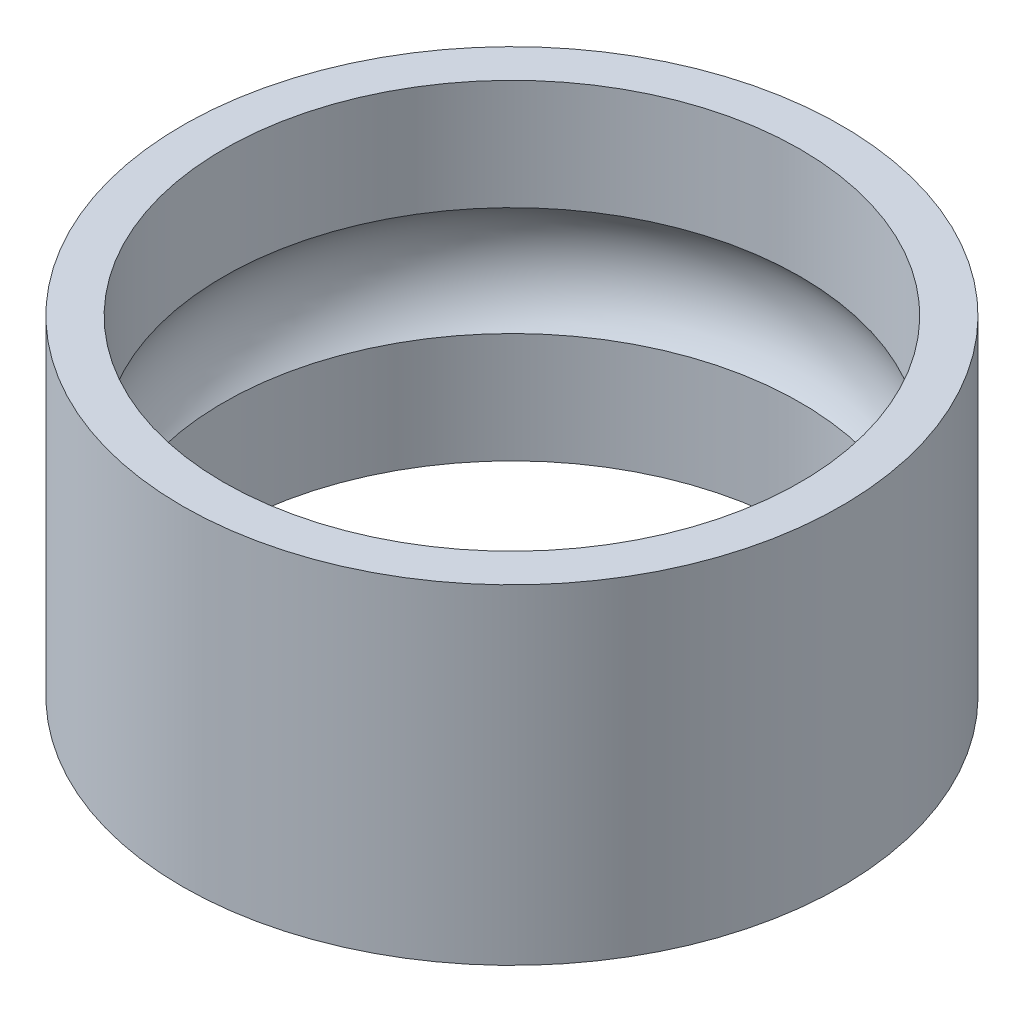
ISO-10303-21;
HEADER;
FILE_DESCRIPTION(('STEP AP214'),'2;1');
FILE_NAME('part.step','',(''),(''),'','','');
FILE_SCHEMA(('AUTOMOTIVE_DESIGN { 1 0 10303 214 1 1 1 1 }'));
ENDSEC;
DATA;
#1=APPLICATION_CONTEXT('core data for automotive mechanical design processes');
#2=APPLICATION_PROTOCOL_DEFINITION('international standard','automotive_design',2000,#1);
#3=PRODUCT_CONTEXT('',#1,'mechanical');
#4=PRODUCT('Part','Part','',(#3));
#5=PRODUCT_RELATED_PRODUCT_CATEGORY('part','',(#4));
#6=PRODUCT_DEFINITION_FORMATION('','',#4);
#7=PRODUCT_DEFINITION_CONTEXT('part definition',#1,'design');
#8=PRODUCT_DEFINITION('design','',#6,#7);
#9=PRODUCT_DEFINITION_SHAPE('','',#8);
#10=(LENGTH_UNIT() NAMED_UNIT(*) SI_UNIT(.MILLI.,.METRE.));
#11=(NAMED_UNIT(*) PLANE_ANGLE_UNIT() SI_UNIT($,.RADIAN.));
#12=(NAMED_UNIT(*) SI_UNIT($,.STERADIAN.) SOLID_ANGLE_UNIT());
#13=UNCERTAINTY_MEASURE_WITH_UNIT(LENGTH_MEASURE(1.E-05),#10,'distance_accuracy_value','');
#14=(GEOMETRIC_REPRESENTATION_CONTEXT(3) GLOBAL_UNCERTAINTY_ASSIGNED_CONTEXT((#13)) GLOBAL_UNIT_ASSIGNED_CONTEXT((#10,
#11,#12)) REPRESENTATION_CONTEXT('',''));
#15=CARTESIAN_POINT('',(0.,0.,0.));
#16=DIRECTION('',(0.,0.,1.));
#17=DIRECTION('',(1.,0.,0.));
#18=AXIS2_PLACEMENT_3D('',#15,#16,#17);
#19=CARTESIAN_POINT('',(0.,2.,0.));
#20=DIRECTION('',(0.,-1.,0.));
#21=DIRECTION('',(0.,0.,-1.));
#22=AXIS2_PLACEMENT_3D('',#19,#20,#21);
#23=CYLINDRICAL_SURFACE('',#22,3.5);
#24=CARTESIAN_POINT('',(0.,2.,0.));
#25=DIRECTION('',(0.,1.,0.));
#26=DIRECTION('',(0.,0.,1.));
#27=AXIS2_PLACEMENT_3D('',#24,#25,#26);
#28=CIRCLE('',#27,3.5);
#29=CARTESIAN_POINT('',(0.,2.,3.5));
#30=VERTEX_POINT('',#29);
#31=EDGE_CURVE('E51',#30,#30,#28,.T.);
#32=ORIENTED_EDGE('',*,*,#31,.T.);
#33=EDGE_LOOP('',(#32));
#34=FACE_BOUND('',#33,.T.);
#35=CARTESIAN_POINT('',(0.,0.661437827766148,0.));
#36=DIRECTION('',(0.,-1.,0.));
#37=DIRECTION('',(0.,0.,-1.));
#38=AXIS2_PLACEMENT_3D('',#35,#36,#37);
#39=CIRCLE('',#38,3.5);
#40=CARTESIAN_POINT('',(0.,0.661437827766148,-3.5));
#41=VERTEX_POINT('',#40);
#42=EDGE_CURVE('E39',#41,#41,#39,.T.);
#43=ORIENTED_EDGE('',*,*,#42,.T.);
#44=EDGE_LOOP('',(#43));
#45=FACE_BOUND('',#44,.T.);
#46=ADVANCED_FACE('F35',(#34,#45),#23,.F.);
#47=CARTESIAN_POINT('',(0.,-2.,0.));
#48=DIRECTION('',(0.,1.,0.));
#49=DIRECTION('',(0.,0.,1.));
#50=AXIS2_PLACEMENT_3D('',#47,#48,#49);
#51=CIRCLE('',#50,3.5);
#52=CARTESIAN_POINT('',(0.,-2.,3.5));
#53=VERTEX_POINT('',#52);
#54=EDGE_CURVE('E54',#53,#53,#51,.T.);
#55=ORIENTED_EDGE('',*,*,#54,.F.);
#56=EDGE_LOOP('',(#55));
#57=FACE_BOUND('',#56,.T.);
#58=CARTESIAN_POINT('',(0.,-0.661437827766148,0.));
#59=DIRECTION('',(0.,1.,0.));
#60=DIRECTION('',(0.,0.,1.));
#61=AXIS2_PLACEMENT_3D('',#58,#59,#60);
#62=CIRCLE('',#61,3.5);
#63=CARTESIAN_POINT('',(0.,-0.661437827766148,3.5));
#64=VERTEX_POINT('',#63);
#65=EDGE_CURVE('E56',#64,#64,#62,.T.);
#66=ORIENTED_EDGE('',*,*,#65,.T.);
#67=EDGE_LOOP('',(#66));
#68=FACE_BOUND('',#67,.T.);
#69=ADVANCED_FACE('F76',(#57,#68),#23,.F.);
#70=CARTESIAN_POINT('',(0.,2.,0.));
#71=DIRECTION('',(0.,1.,0.));
#72=DIRECTION('',(0.,0.,1.));
#73=AXIS2_PLACEMENT_3D('',#70,#71,#72);
#74=PLANE('',#73);
#75=CARTESIAN_POINT('',(0.,2.,0.));
#76=DIRECTION('',(0.,1.,0.));
#77=DIRECTION('',(0.,0.,1.));
#78=AXIS2_PLACEMENT_3D('',#75,#76,#77);
#79=CIRCLE('',#78,4.);
#80=CARTESIAN_POINT('',(0.,2.,4.));
#81=VERTEX_POINT('',#80);
#82=EDGE_CURVE('E10',#81,#81,#79,.T.);
#83=ORIENTED_EDGE('',*,*,#82,.T.);
#84=EDGE_LOOP('',(#83));
#85=FACE_BOUND('',#84,.T.);
#86=ORIENTED_EDGE('',*,*,#31,.F.);
#87=EDGE_LOOP('',(#86));
#88=FACE_BOUND('',#87,.T.);
#89=ADVANCED_FACE('F73',(#85,#88),#74,.T.);
#90=CARTESIAN_POINT('',(0.,-2.,0.));
#91=DIRECTION('',(0.,1.,0.));
#92=DIRECTION('',(0.,0.,1.));
#93=AXIS2_PLACEMENT_3D('',#90,#91,#92);
#94=PLANE('',#93);
#95=CARTESIAN_POINT('',(0.,-2.,0.));
#96=DIRECTION('',(0.,1.,0.));
#97=DIRECTION('',(0.,0.,1.));
#98=AXIS2_PLACEMENT_3D('',#95,#96,#97);
#99=CIRCLE('',#98,4.);
#100=CARTESIAN_POINT('',(0.,-2.,4.));
#101=VERTEX_POINT('',#100);
#102=EDGE_CURVE('E44',#101,#101,#99,.T.);
#103=ORIENTED_EDGE('',*,*,#102,.F.);
#104=EDGE_LOOP('',(#103));
#105=FACE_BOUND('',#104,.T.);
#106=ORIENTED_EDGE('',*,*,#54,.T.);
#107=EDGE_LOOP('',(#106));
#108=FACE_BOUND('',#107,.T.);
#109=ADVANCED_FACE('F75',(#105,#108),#94,.F.);
#110=CARTESIAN_POINT('',(0.,2.,0.));
#111=DIRECTION('',(0.,-1.,0.));
#112=DIRECTION('',(0.,0.,-1.));
#113=AXIS2_PLACEMENT_3D('',#110,#111,#112);
#114=CYLINDRICAL_SURFACE('',#113,4.);
#115=ORIENTED_EDGE('',*,*,#82,.F.);
#116=EDGE_LOOP('',(#115));
#117=FACE_BOUND('',#116,.T.);
#118=ORIENTED_EDGE('',*,*,#102,.T.);
#119=EDGE_LOOP('',(#118));
#120=FACE_BOUND('',#119,.T.);
#121=ADVANCED_FACE('F37',(#117,#120),#114,.T.);
#122=CARTESIAN_POINT('',(0.,0.,0.));
#123=DIRECTION('',(0.,1.,0.));
#124=DIRECTION('',(0.,0.,1.));
#125=AXIS2_PLACEMENT_3D('',#122,#123,#124);
#126=TOROIDAL_SURFACE('',#125,2.75,1.);
#127=ORIENTED_EDGE('',*,*,#42,.F.);
#128=EDGE_LOOP('',(#127));
#129=FACE_BOUND('',#128,.T.);
#130=ORIENTED_EDGE('',*,*,#65,.F.);
#131=EDGE_LOOP('',(#130));
#132=FACE_BOUND('',#131,.T.);
#133=ADVANCED_FACE('F89',(#129,#132),#126,.F.);
#134=CLOSED_SHELL('',(#46,#69,#89,#109,#121,#133));
#135=MANIFOLD_SOLID_BREP('B2',#134);
#136=ADVANCED_BREP_SHAPE_REPRESENTATION('',(#18,#135),#14);
#137=SHAPE_DEFINITION_REPRESENTATION(#9,#136);
ENDSEC;
END-ISO-10303-21;
